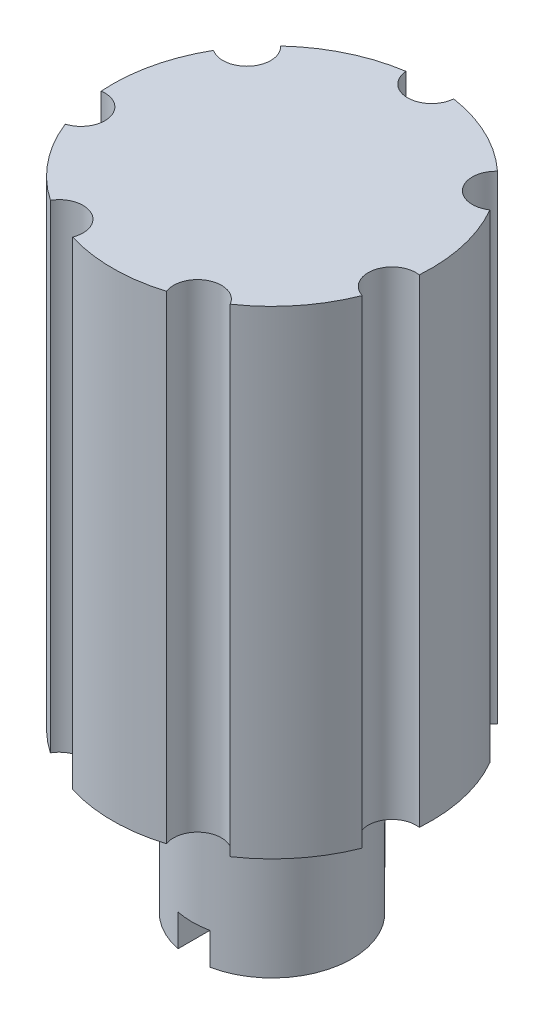
ISO-10303-21;
HEADER;
FILE_DESCRIPTION(('STEP AP214'),'2;1');
FILE_NAME('part.step','',(''),(''),'','','');
FILE_SCHEMA(('AUTOMOTIVE_DESIGN { 1 0 10303 214 1 1 1 1 }'));
ENDSEC;
DATA;
#1=APPLICATION_CONTEXT('core data for automotive mechanical design processes');
#2=APPLICATION_PROTOCOL_DEFINITION('international standard','automotive_design',2000,#1);
#3=PRODUCT_CONTEXT('',#1,'mechanical');
#4=PRODUCT('Part','Part','',(#3));
#5=PRODUCT_RELATED_PRODUCT_CATEGORY('part','',(#4));
#6=PRODUCT_DEFINITION_FORMATION('','',#4);
#7=PRODUCT_DEFINITION_CONTEXT('part definition',#1,'design');
#8=PRODUCT_DEFINITION('design','',#6,#7);
#9=PRODUCT_DEFINITION_SHAPE('','',#8);
#10=(LENGTH_UNIT() NAMED_UNIT(*) SI_UNIT(.MILLI.,.METRE.));
#11=(NAMED_UNIT(*) PLANE_ANGLE_UNIT() SI_UNIT($,.RADIAN.));
#12=(NAMED_UNIT(*) SI_UNIT($,.STERADIAN.) SOLID_ANGLE_UNIT());
#13=UNCERTAINTY_MEASURE_WITH_UNIT(LENGTH_MEASURE(1.E-05),#10,'distance_accuracy_value','');
#14=(GEOMETRIC_REPRESENTATION_CONTEXT(3) GLOBAL_UNCERTAINTY_ASSIGNED_CONTEXT((#13)) GLOBAL_UNIT_ASSIGNED_CONTEXT((#10,
#11,#12)) REPRESENTATION_CONTEXT('',''));
#15=CARTESIAN_POINT('',(0.,0.,0.));
#16=DIRECTION('',(0.,0.,1.));
#17=DIRECTION('',(1.,0.,0.));
#18=AXIS2_PLACEMENT_3D('',#15,#16,#17);
#19=CARTESIAN_POINT('',(0.,20.,0.));
#20=DIRECTION('',(0.,-1.,0.));
#21=DIRECTION('',(0.,0.,-1.));
#22=AXIS2_PLACEMENT_3D('',#19,#20,#21);
#23=CYLINDRICAL_SURFACE('',#22,5.);
#24=CARTESIAN_POINT('',(0.,5.,0.));
#25=DIRECTION('',(0.,1.,0.));
#26=DIRECTION('',(0.,0.,1.));
#27=AXIS2_PLACEMENT_3D('',#24,#25,#26);
#28=CIRCLE('',#27,5.);
#29=CARTESIAN_POINT('',(3.39887906854121,5.,-3.66709981830771));
#30=VERTEX_POINT('',#29);
#31=CARTESIAN_POINT('',(0.747887650319217,5.,-4.94375));
#32=VERTEX_POINT('',#31);
#33=EDGE_CURVE('E209',#30,#32,#28,.T.);
#34=ORIENTED_EDGE('',*,*,#33,.T.);
#35=DIRECTION('',(0.,1.,0.));
#36=VECTOR('',#35,1.);
#37=CARTESIAN_POINT('',(0.747887650319217,12.5,-4.94375));
#38=LINE('',#37,#36);
#39=CARTESIAN_POINT('',(0.747887650319217,20.,-4.94375));
#40=VERTEX_POINT('',#39);
#41=EDGE_CURVE('E226',#32,#40,#38,.T.);
#42=ORIENTED_EDGE('',*,*,#41,.T.);
#43=CARTESIAN_POINT('',(0.,20.,0.));
#44=DIRECTION('',(0.,1.,0.));
#45=DIRECTION('',(0.,0.,1.));
#46=AXIS2_PLACEMENT_3D('',#43,#44,#45);
#47=CIRCLE('',#46,5.);
#48=CARTESIAN_POINT('',(3.39887906854121,20.,-3.66709981830771));
#49=VERTEX_POINT('',#48);
#50=EDGE_CURVE('E370',#49,#40,#47,.T.);
#51=ORIENTED_EDGE('',*,*,#50,.F.);
#52=DIRECTION('',(0.,1.,0.));
#53=VECTOR('',#52,1.);
#54=CARTESIAN_POINT('',(3.39887906854121,12.5,-3.66709981830771));
#55=LINE('',#54,#53);
#56=EDGE_CURVE('E236',#49,#30,#55,.F.);
#57=ORIENTED_EDGE('',*,*,#56,.T.);
#58=EDGE_LOOP('',(#34,#42,#51,#57));
#59=FACE_BOUND('',#58,.T.);
#60=ADVANCED_FACE('F38',(#59),#23,.T.);
#61=CARTESIAN_POINT('',(4.98622052429231,5.,0.370951321774265));
#62=VERTEX_POINT('',#61);
#63=CARTESIAN_POINT('',(4.33147971436145,5.,-2.4976555975705));
#64=VERTEX_POINT('',#63);
#65=EDGE_CURVE('E207',#62,#64,#28,.T.);
#66=ORIENTED_EDGE('',*,*,#65,.T.);
#67=DIRECTION('',(0.,1.,0.));
#68=VECTOR('',#67,1.);
#69=CARTESIAN_POINT('',(4.33147971436145,12.5,-2.4976555975705));
#70=LINE('',#69,#68);
#71=CARTESIAN_POINT('',(4.33147971436145,20.,-2.4976555975705));
#72=VERTEX_POINT('',#71);
#73=EDGE_CURVE('E217',#64,#72,#70,.T.);
#74=ORIENTED_EDGE('',*,*,#73,.T.);
#75=CARTESIAN_POINT('',(4.98622052429231,20.,0.370951321774265));
#76=VERTEX_POINT('',#75);
#77=EDGE_CURVE('E193',#76,#72,#47,.T.);
#78=ORIENTED_EDGE('',*,*,#77,.F.);
#79=DIRECTION('',(0.,1.,0.));
#80=VECTOR('',#79,1.);
#81=CARTESIAN_POINT('',(4.98622052429231,12.5,0.370951321774265));
#82=LINE('',#81,#80);
#83=EDGE_CURVE('E219',#76,#62,#82,.F.);
#84=ORIENTED_EDGE('',*,*,#83,.T.);
#85=EDGE_LOOP('',(#66,#74,#78,#84));
#86=FACE_BOUND('',#85,.T.);
#87=ADVANCED_FACE('F215',(#86),#23,.T.);
#88=CARTESIAN_POINT('',(2.81883622488871,5.,4.12966855053226));
#89=VERTEX_POINT('',#88);
#90=CARTESIAN_POINT('',(4.65337920740546,5.,1.82922441271883));
#91=VERTEX_POINT('',#90);
#92=EDGE_CURVE('E220',#89,#91,#28,.T.);
#93=ORIENTED_EDGE('',*,*,#92,.T.);
#94=DIRECTION('',(0.,1.,0.));
#95=VECTOR('',#94,1.);
#96=CARTESIAN_POINT('',(4.65337920740546,12.5,1.82922441271883));
#97=LINE('',#96,#95);
#98=CARTESIAN_POINT('',(4.65337920740546,20.,1.82922441271883));
#99=VERTEX_POINT('',#98);
#100=EDGE_CURVE('E238',#91,#99,#97,.T.);
#101=ORIENTED_EDGE('',*,*,#100,.T.);
#102=CARTESIAN_POINT('',(2.81883622488871,20.,4.12966855053226));
#103=VERTEX_POINT('',#102);
#104=EDGE_CURVE('E187',#103,#99,#47,.T.);
#105=ORIENTED_EDGE('',*,*,#104,.F.);
#106=DIRECTION('',(0.,1.,0.));
#107=VECTOR('',#106,1.);
#108=CARTESIAN_POINT('',(2.81883622488871,12.5,4.12966855053226));
#109=LINE('',#108,#107);
#110=EDGE_CURVE('E245',#103,#89,#109,.F.);
#111=ORIENTED_EDGE('',*,*,#110,.T.);
#112=EDGE_LOOP('',(#93,#101,#105,#111));
#113=FACE_BOUND('',#112,.T.);
#114=ADVANCED_FACE('F322',(#113),#23,.T.);
#115=CARTESIAN_POINT('',(-1.47118924563616,5.,4.77866113085292));
#116=VERTEX_POINT('',#115);
#117=CARTESIAN_POINT('',(1.47118924563609,5.,4.77866113085294));
#118=VERTEX_POINT('',#117);
#119=EDGE_CURVE('E222',#116,#118,#28,.T.);
#120=ORIENTED_EDGE('',*,*,#119,.T.);
#121=DIRECTION('',(0.,1.,0.));
#122=VECTOR('',#121,1.);
#123=CARTESIAN_POINT('',(1.47118924563609,12.5,4.77866113085294));
#124=LINE('',#123,#122);
#125=CARTESIAN_POINT('',(1.47118924563609,20.,4.77866113085294));
#126=VERTEX_POINT('',#125);
#127=EDGE_CURVE('E242',#118,#126,#124,.T.);
#128=ORIENTED_EDGE('',*,*,#127,.T.);
#129=CARTESIAN_POINT('',(-1.47118924563616,20.,4.77866113085292));
#130=VERTEX_POINT('',#129);
#131=EDGE_CURVE('E195',#130,#126,#47,.T.);
#132=ORIENTED_EDGE('',*,*,#131,.F.);
#133=DIRECTION('',(0.,1.,0.));
#134=VECTOR('',#133,1.);
#135=CARTESIAN_POINT('',(-1.47118924563616,12.5,4.77866113085292));
#136=LINE('',#135,#134);
#137=EDGE_CURVE('E249',#130,#116,#136,.F.);
#138=ORIENTED_EDGE('',*,*,#137,.T.);
#139=EDGE_LOOP('',(#120,#128,#132,#138));
#140=FACE_BOUND('',#139,.T.);
#141=ADVANCED_FACE('F343',(#140),#23,.T.);
#142=CARTESIAN_POINT('',(-4.65337920740548,5.,1.82922441271877));
#143=VERTEX_POINT('',#142);
#144=CARTESIAN_POINT('',(-2.81883622488877,5.,4.12966855053222));
#145=VERTEX_POINT('',#144);
#146=EDGE_CURVE('E225',#143,#145,#28,.T.);
#147=ORIENTED_EDGE('',*,*,#146,.T.);
#148=DIRECTION('',(0.,1.,0.));
#149=VECTOR('',#148,1.);
#150=CARTESIAN_POINT('',(-2.81883622488877,12.5,4.12966855053222));
#151=LINE('',#150,#149);
#152=CARTESIAN_POINT('',(-2.81883622488877,20.,4.12966855053222));
#153=VERTEX_POINT('',#152);
#154=EDGE_CURVE('E61',#145,#153,#151,.T.);
#155=ORIENTED_EDGE('',*,*,#154,.T.);
#156=CARTESIAN_POINT('',(-4.65337920740548,20.,1.82922441271877));
#157=VERTEX_POINT('',#156);
#158=EDGE_CURVE('E229',#157,#153,#47,.T.);
#159=ORIENTED_EDGE('',*,*,#158,.F.);
#160=DIRECTION('',(0.,1.,0.));
#161=VECTOR('',#160,1.);
#162=CARTESIAN_POINT('',(-4.65337920740548,12.5,1.82922441271877));
#163=LINE('',#162,#161);
#164=EDGE_CURVE('E255',#157,#143,#163,.F.);
#165=ORIENTED_EDGE('',*,*,#164,.T.);
#166=EDGE_LOOP('',(#147,#155,#159,#165));
#167=FACE_BOUND('',#166,.T.);
#168=ADVANCED_FACE('F336',(#167),#23,.T.);
#169=CARTESIAN_POINT('',(-4.33147971436141,5.,-2.49765559757056));
#170=VERTEX_POINT('',#169);
#171=CARTESIAN_POINT('',(-4.98622052429232,5.,0.370951321774198));
#172=VERTEX_POINT('',#171);
#173=EDGE_CURVE('E347',#170,#172,#28,.T.);
#174=ORIENTED_EDGE('',*,*,#173,.T.);
#175=DIRECTION('',(0.,1.,0.));
#176=VECTOR('',#175,1.);
#177=CARTESIAN_POINT('',(-4.98622052429232,12.5,0.370951321774197));
#178=LINE('',#177,#176);
#179=CARTESIAN_POINT('',(-4.98622052429232,20.,0.370951321774197));
#180=VERTEX_POINT('',#179);
#181=EDGE_CURVE('E252',#172,#180,#178,.T.);
#182=ORIENTED_EDGE('',*,*,#181,.T.);
#183=CARTESIAN_POINT('',(-4.33147971436141,20.,-2.49765559757056));
#184=VERTEX_POINT('',#183);
#185=EDGE_CURVE('E366',#184,#180,#47,.T.);
#186=ORIENTED_EDGE('',*,*,#185,.F.);
#187=DIRECTION('',(0.,1.,0.));
#188=VECTOR('',#187,1.);
#189=CARTESIAN_POINT('',(-4.33147971436141,12.5,-2.49765559757056));
#190=LINE('',#189,#188);
#191=EDGE_CURVE('E261',#184,#170,#190,.F.);
#192=ORIENTED_EDGE('',*,*,#191,.T.);
#193=EDGE_LOOP('',(#174,#182,#186,#192));
#194=FACE_BOUND('',#193,.T.);
#195=ADVANCED_FACE('F327',(#194),#23,.T.);
#196=CARTESIAN_POINT('',(0.,5.,0.));
#197=DIRECTION('',(0.,-1.,0.));
#198=DIRECTION('',(0.,0.,-1.));
#199=AXIS2_PLACEMENT_3D('',#196,#197,#198);
#200=CYLINDRICAL_SURFACE('',#199,2.5);
#201=CARTESIAN_POINT('',(0.,5.,0.));
#202=DIRECTION('',(0.,1.,0.));
#203=DIRECTION('',(0.,0.,1.));
#204=AXIS2_PLACEMENT_3D('',#201,#202,#203);
#205=CIRCLE('',#204,2.5);
#206=CARTESIAN_POINT('',(0.,5.,2.5));
#207=VERTEX_POINT('',#206);
#208=EDGE_CURVE('E186',#207,#207,#205,.T.);
#209=ORIENTED_EDGE('',*,*,#208,.F.);
#210=EDGE_LOOP('',(#209));
#211=FACE_BOUND('',#210,.T.);
#212=CARTESIAN_POINT('',(0.,1.,0.));
#213=DIRECTION('',(0.,-1.,0.));
#214=DIRECTION('',(0.,0.,-1.));
#215=AXIS2_PLACEMENT_3D('',#212,#213,#214);
#216=CIRCLE('',#215,2.5);
#217=CARTESIAN_POINT('',(-0.5,1.,2.44948974278318));
#218=VERTEX_POINT('',#217);
#219=CARTESIAN_POINT('',(0.5,1.,2.44948974278318));
#220=VERTEX_POINT('',#219);
#221=EDGE_CURVE('E289',#218,#220,#216,.F.);
#222=ORIENTED_EDGE('',*,*,#221,.T.);
#223=DIRECTION('',(0.,-1.,0.));
#224=VECTOR('',#223,1.);
#225=CARTESIAN_POINT('',(0.5,2.68353211472345,2.44948974278318));
#226=LINE('',#225,#224);
#227=CARTESIAN_POINT('',(0.5,0.,2.44948974278318));
#228=VERTEX_POINT('',#227);
#229=EDGE_CURVE('E185',#220,#228,#226,.T.);
#230=ORIENTED_EDGE('',*,*,#229,.T.);
#231=CARTESIAN_POINT('',(0.,0.,0.));
#232=DIRECTION('',(0.,1.,0.));
#233=DIRECTION('',(0.,0.,1.));
#234=AXIS2_PLACEMENT_3D('',#231,#232,#233);
#235=CIRCLE('',#234,2.5);
#236=CARTESIAN_POINT('',(-0.5,0.,2.44948974278318));
#237=VERTEX_POINT('',#236);
#238=EDGE_CURVE('E179',#228,#237,#235,.T.);
#239=ORIENTED_EDGE('',*,*,#238,.T.);
#240=DIRECTION('',(0.,-1.,0.));
#241=VECTOR('',#240,1.);
#242=CARTESIAN_POINT('',(-0.5,2.68353211472345,2.44948974278318));
#243=LINE('',#242,#241);
#244=EDGE_CURVE('E163',#218,#237,#243,.T.);
#245=ORIENTED_EDGE('',*,*,#244,.F.);
#246=EDGE_LOOP('',(#222,#230,#239,#245));
#247=FACE_BOUND('',#246,.T.);
#248=ADVANCED_FACE('F40',(#211,#247),#200,.T.);
#249=CARTESIAN_POINT('',(0.,0.,0.));
#250=DIRECTION('',(0.,1.,0.));
#251=DIRECTION('',(0.,0.,1.));
#252=AXIS2_PLACEMENT_3D('',#249,#250,#251);
#253=PLANE('',#252);
#254=ORIENTED_EDGE('',*,*,#238,.F.);
#255=DIRECTION('',(0.,0.,1.));
#256=VECTOR('',#255,1.);
#257=CARTESIAN_POINT('',(0.5,0.,2.44948974278318));
#258=LINE('',#257,#256);
#259=CARTESIAN_POINT('',(0.5,0.,1.14564392373896));
#260=VERTEX_POINT('',#259);
#261=EDGE_CURVE('E172',#260,#228,#258,.T.);
#262=ORIENTED_EDGE('',*,*,#261,.F.);
#263=CARTESIAN_POINT('',(0.,0.,0.));
#264=DIRECTION('',(0.,-1.,0.));
#265=DIRECTION('',(0.,0.,-1.));
#266=AXIS2_PLACEMENT_3D('',#263,#264,#265);
#267=CIRCLE('',#266,1.25);
#268=CARTESIAN_POINT('',(-0.5,0.,1.14564392373896));
#269=VERTEX_POINT('',#268);
#270=EDGE_CURVE('E181',#269,#260,#267,.T.);
#271=ORIENTED_EDGE('',*,*,#270,.F.);
#272=DIRECTION('',(0.,0.,-1.));
#273=VECTOR('',#272,1.);
#274=CARTESIAN_POINT('',(-0.5,0.,2.44948974278318));
#275=LINE('',#274,#273);
#276=EDGE_CURVE('E166',#237,#269,#275,.T.);
#277=ORIENTED_EDGE('',*,*,#276,.F.);
#278=EDGE_LOOP('',(#254,#262,#271,#277));
#279=FACE_BOUND('',#278,.T.);
#280=ADVANCED_FACE('F177',(#279),#253,.F.);
#281=CARTESIAN_POINT('',(-0.747887650319217,20.,-4.94375));
#282=VERTEX_POINT('',#281);
#283=CARTESIAN_POINT('',(-3.39887906854115,20.,-3.66709981830776));
#284=VERTEX_POINT('',#283);
#285=EDGE_CURVE('E367',#282,#284,#47,.T.);
#286=ORIENTED_EDGE('',*,*,#285,.F.);
#287=DIRECTION('',(0.,1.,0.));
#288=VECTOR('',#287,1.);
#289=CARTESIAN_POINT('',(-0.747887650319217,12.5,-4.94375));
#290=LINE('',#289,#288);
#291=CARTESIAN_POINT('',(-0.747887650319217,5.,-4.94375));
#292=VERTEX_POINT('',#291);
#293=EDGE_CURVE('E232',#282,#292,#290,.F.);
#294=ORIENTED_EDGE('',*,*,#293,.T.);
#295=CARTESIAN_POINT('',(-3.39887906854116,5.,-3.66709981830776));
#296=VERTEX_POINT('',#295);
#297=EDGE_CURVE('E223',#292,#296,#28,.T.);
#298=ORIENTED_EDGE('',*,*,#297,.T.);
#299=DIRECTION('',(0.,1.,0.));
#300=VECTOR('',#299,1.);
#301=CARTESIAN_POINT('',(-3.39887906854115,12.5,-3.66709981830776));
#302=LINE('',#301,#300);
#303=EDGE_CURVE('E258',#296,#284,#302,.T.);
#304=ORIENTED_EDGE('',*,*,#303,.T.);
#305=EDGE_LOOP('',(#286,#294,#298,#304));
#306=FACE_BOUND('',#305,.T.);
#307=ADVANCED_FACE('F318',(#306),#23,.T.);
#308=CARTESIAN_POINT('',(0.,20.,0.));
#309=DIRECTION('',(0.,1.,0.));
#310=DIRECTION('',(0.,0.,1.));
#311=AXIS2_PLACEMENT_3D('',#308,#309,#310);
#312=PLANE('',#311);
#313=CARTESIAN_POINT('',(0.,20.,-5.));
#314=DIRECTION('',(0.,1.,0.));
#315=DIRECTION('',(0.,0.,1.));
#316=AXIS2_PLACEMENT_3D('',#313,#314,#315);
#317=CIRCLE('',#316,0.75);
#318=EDGE_CURVE('E264',#282,#40,#317,.T.);
#319=ORIENTED_EDGE('',*,*,#318,.F.);
#320=ORIENTED_EDGE('',*,*,#285,.T.);
#321=CARTESIAN_POINT('',(-3.90915741234011,20.,-3.11744900929372));
#322=DIRECTION('',(0.,1.,0.));
#323=DIRECTION('',(0.,0.,1.));
#324=AXIS2_PLACEMENT_3D('',#321,#322,#323);
#325=CIRCLE('',#324,0.75);
#326=EDGE_CURVE('E265',#184,#284,#325,.T.);
#327=ORIENTED_EDGE('',*,*,#326,.F.);
#328=ORIENTED_EDGE('',*,*,#185,.T.);
#329=CARTESIAN_POINT('',(-4.87463956090913,20.,1.11260466978153));
#330=DIRECTION('',(0.,1.,0.));
#331=DIRECTION('',(0.,0.,1.));
#332=AXIS2_PLACEMENT_3D('',#329,#330,#331);
#333=CIRCLE('',#332,0.75);
#334=EDGE_CURVE('E269',#157,#180,#333,.T.);
#335=ORIENTED_EDGE('',*,*,#334,.F.);
#336=ORIENTED_EDGE('',*,*,#158,.T.);
#337=CARTESIAN_POINT('',(-2.16941869558783,20.,4.50484433951208));
#338=DIRECTION('',(0.,1.,0.));
#339=DIRECTION('',(0.,0.,1.));
#340=AXIS2_PLACEMENT_3D('',#337,#338,#339);
#341=CIRCLE('',#340,0.75);
#342=EDGE_CURVE('E273',#130,#153,#341,.T.);
#343=ORIENTED_EDGE('',*,*,#342,.F.);
#344=ORIENTED_EDGE('',*,*,#131,.T.);
#345=CARTESIAN_POINT('',(2.16941869558776,20.,4.50484433951211));
#346=DIRECTION('',(0.,1.,0.));
#347=DIRECTION('',(0.,0.,1.));
#348=AXIS2_PLACEMENT_3D('',#345,#346,#347);
#349=CIRCLE('',#348,0.75);
#350=EDGE_CURVE('E277',#103,#126,#349,.T.);
#351=ORIENTED_EDGE('',*,*,#350,.F.);
#352=ORIENTED_EDGE('',*,*,#104,.T.);
#353=CARTESIAN_POINT('',(4.87463956090911,20.,1.11260466978159));
#354=DIRECTION('',(0.,1.,0.));
#355=DIRECTION('',(0.,0.,1.));
#356=AXIS2_PLACEMENT_3D('',#353,#354,#355);
#357=CIRCLE('',#356,0.75);
#358=EDGE_CURVE('E281',#76,#99,#357,.T.);
#359=ORIENTED_EDGE('',*,*,#358,.F.);
#360=ORIENTED_EDGE('',*,*,#77,.T.);
#361=CARTESIAN_POINT('',(3.90915741234015,20.,-3.11744900929366));
#362=DIRECTION('',(0.,1.,0.));
#363=DIRECTION('',(0.,0.,1.));
#364=AXIS2_PLACEMENT_3D('',#361,#362,#363);
#365=CIRCLE('',#364,0.75);
#366=EDGE_CURVE('E283',#49,#72,#365,.T.);
#367=ORIENTED_EDGE('',*,*,#366,.F.);
#368=ORIENTED_EDGE('',*,*,#50,.T.);
#369=EDGE_LOOP('',(#319,#320,#327,#328,#335,#336,#343,#344,#351,#352,#359,#360,#367,#368));
#370=FACE_BOUND('',#369,.T.);
#371=ADVANCED_FACE('F325',(#370),#312,.T.);
#372=CARTESIAN_POINT('',(0.,5.,0.));
#373=DIRECTION('',(0.,1.,0.));
#374=DIRECTION('',(0.,0.,1.));
#375=AXIS2_PLACEMENT_3D('',#372,#373,#374);
#376=PLANE('',#375);
#377=ORIENTED_EDGE('',*,*,#208,.T.);
#378=EDGE_LOOP('',(#377));
#379=FACE_BOUND('',#378,.T.);
#380=ORIENTED_EDGE('',*,*,#297,.F.);
#381=CARTESIAN_POINT('',(0.,5.,-5.));
#382=DIRECTION('',(0.,1.,0.));
#383=DIRECTION('',(0.,0.,1.));
#384=AXIS2_PLACEMENT_3D('',#381,#382,#383);
#385=CIRCLE('',#384,0.75);
#386=EDGE_CURVE('E11',#292,#32,#385,.T.);
#387=ORIENTED_EDGE('',*,*,#386,.T.);
#388=ORIENTED_EDGE('',*,*,#33,.F.);
#389=CARTESIAN_POINT('',(3.90915741234015,5.,-3.11744900929366));
#390=DIRECTION('',(0.,1.,0.));
#391=DIRECTION('',(0.,0.,1.));
#392=AXIS2_PLACEMENT_3D('',#389,#390,#391);
#393=CIRCLE('',#392,0.75);
#394=EDGE_CURVE('E46',#30,#64,#393,.T.);
#395=ORIENTED_EDGE('',*,*,#394,.T.);
#396=ORIENTED_EDGE('',*,*,#65,.F.);
#397=CARTESIAN_POINT('',(4.87463956090911,5.,1.11260466978159));
#398=DIRECTION('',(0.,1.,0.));
#399=DIRECTION('',(0.,0.,1.));
#400=AXIS2_PLACEMENT_3D('',#397,#398,#399);
#401=CIRCLE('',#400,0.75);
#402=EDGE_CURVE('E279',#91,#62,#401,.F.);
#403=ORIENTED_EDGE('',*,*,#402,.F.);
#404=ORIENTED_EDGE('',*,*,#92,.F.);
#405=CARTESIAN_POINT('',(2.16941869558776,5.,4.50484433951211));
#406=DIRECTION('',(0.,1.,0.));
#407=DIRECTION('',(0.,0.,1.));
#408=AXIS2_PLACEMENT_3D('',#405,#406,#407);
#409=CIRCLE('',#408,0.75);
#410=EDGE_CURVE('E275',#118,#89,#409,.F.);
#411=ORIENTED_EDGE('',*,*,#410,.F.);
#412=ORIENTED_EDGE('',*,*,#119,.F.);
#413=CARTESIAN_POINT('',(-2.16941869558783,5.,4.50484433951208));
#414=DIRECTION('',(0.,1.,0.));
#415=DIRECTION('',(0.,0.,1.));
#416=AXIS2_PLACEMENT_3D('',#413,#414,#415);
#417=CIRCLE('',#416,0.75);
#418=EDGE_CURVE('E271',#145,#116,#417,.F.);
#419=ORIENTED_EDGE('',*,*,#418,.F.);
#420=ORIENTED_EDGE('',*,*,#146,.F.);
#421=CARTESIAN_POINT('',(-4.87463956090913,5.,1.11260466978153));
#422=DIRECTION('',(0.,1.,0.));
#423=DIRECTION('',(0.,0.,1.));
#424=AXIS2_PLACEMENT_3D('',#421,#422,#423);
#425=CIRCLE('',#424,0.75);
#426=EDGE_CURVE('E267',#172,#143,#425,.F.);
#427=ORIENTED_EDGE('',*,*,#426,.F.);
#428=ORIENTED_EDGE('',*,*,#173,.F.);
#429=CARTESIAN_POINT('',(-3.90915741234011,5.,-3.11744900929372));
#430=DIRECTION('',(0.,1.,0.));
#431=DIRECTION('',(0.,0.,1.));
#432=AXIS2_PLACEMENT_3D('',#429,#430,#431);
#433=CIRCLE('',#432,0.75);
#434=EDGE_CURVE('E190',#170,#296,#433,.T.);
#435=ORIENTED_EDGE('',*,*,#434,.T.);
#436=EDGE_LOOP('',(#380,#387,#388,#395,#396,#403,#404,#411,#412,#419,#420,#427,#428,#435));
#437=FACE_BOUND('',#436,.T.);
#438=ADVANCED_FACE('F205',(#379,#437),#376,.F.);
#439=CARTESIAN_POINT('',(-3.90915741234011,2.87867965644036,-3.11744900929372));
#440=DIRECTION('',(0.,1.,0.));
#441=DIRECTION('',(0.,0.,1.));
#442=AXIS2_PLACEMENT_3D('',#439,#440,#441);
#443=CYLINDRICAL_SURFACE('',#442,0.75);
#444=ORIENTED_EDGE('',*,*,#434,.F.);
#445=ORIENTED_EDGE('',*,*,#191,.F.);
#446=ORIENTED_EDGE('',*,*,#326,.T.);
#447=ORIENTED_EDGE('',*,*,#303,.F.);
#448=EDGE_LOOP('',(#444,#445,#446,#447));
#449=FACE_BOUND('',#448,.T.);
#450=ADVANCED_FACE('F395',(#449),#443,.F.);
#451=CARTESIAN_POINT('',(-4.87463956090913,2.87867965644036,1.11260466978153));
#452=DIRECTION('',(0.,1.,0.));
#453=DIRECTION('',(0.,0.,1.));
#454=AXIS2_PLACEMENT_3D('',#451,#452,#453);
#455=CYLINDRICAL_SURFACE('',#454,0.75);
#456=ORIENTED_EDGE('',*,*,#426,.T.);
#457=ORIENTED_EDGE('',*,*,#164,.F.);
#458=ORIENTED_EDGE('',*,*,#334,.T.);
#459=ORIENTED_EDGE('',*,*,#181,.F.);
#460=EDGE_LOOP('',(#456,#457,#458,#459));
#461=FACE_BOUND('',#460,.T.);
#462=ADVANCED_FACE('F389',(#461),#455,.F.);
#463=CARTESIAN_POINT('',(-2.16941869558783,2.87867965644036,4.50484433951208));
#464=DIRECTION('',(0.,1.,0.));
#465=DIRECTION('',(0.,0.,1.));
#466=AXIS2_PLACEMENT_3D('',#463,#464,#465);
#467=CYLINDRICAL_SURFACE('',#466,0.75);
#468=ORIENTED_EDGE('',*,*,#418,.T.);
#469=ORIENTED_EDGE('',*,*,#137,.F.);
#470=ORIENTED_EDGE('',*,*,#342,.T.);
#471=ORIENTED_EDGE('',*,*,#154,.F.);
#472=EDGE_LOOP('',(#468,#469,#470,#471));
#473=FACE_BOUND('',#472,.T.);
#474=ADVANCED_FACE('F358',(#473),#467,.F.);
#475=CARTESIAN_POINT('',(2.16941869558776,2.87867965644036,4.50484433951211));
#476=DIRECTION('',(0.,1.,0.));
#477=DIRECTION('',(0.,0.,1.));
#478=AXIS2_PLACEMENT_3D('',#475,#476,#477);
#479=CYLINDRICAL_SURFACE('',#478,0.75);
#480=ORIENTED_EDGE('',*,*,#410,.T.);
#481=ORIENTED_EDGE('',*,*,#110,.F.);
#482=ORIENTED_EDGE('',*,*,#350,.T.);
#483=ORIENTED_EDGE('',*,*,#127,.F.);
#484=EDGE_LOOP('',(#480,#481,#482,#483));
#485=FACE_BOUND('',#484,.T.);
#486=ADVANCED_FACE('F380',(#485),#479,.F.);
#487=CARTESIAN_POINT('',(4.87463956090911,2.87867965644036,1.11260466978159));
#488=DIRECTION('',(0.,1.,0.));
#489=DIRECTION('',(0.,0.,1.));
#490=AXIS2_PLACEMENT_3D('',#487,#488,#489);
#491=CYLINDRICAL_SURFACE('',#490,0.75);
#492=ORIENTED_EDGE('',*,*,#402,.T.);
#493=ORIENTED_EDGE('',*,*,#83,.F.);
#494=ORIENTED_EDGE('',*,*,#358,.T.);
#495=ORIENTED_EDGE('',*,*,#100,.F.);
#496=EDGE_LOOP('',(#492,#493,#494,#495));
#497=FACE_BOUND('',#496,.T.);
#498=ADVANCED_FACE('F376',(#497),#491,.F.);
#499=CARTESIAN_POINT('',(3.90915741234015,2.87867965644036,-3.11744900929366));
#500=DIRECTION('',(0.,1.,0.));
#501=DIRECTION('',(0.,0.,1.));
#502=AXIS2_PLACEMENT_3D('',#499,#500,#501);
#503=CYLINDRICAL_SURFACE('',#502,0.75);
#504=ORIENTED_EDGE('',*,*,#394,.F.);
#505=ORIENTED_EDGE('',*,*,#56,.F.);
#506=ORIENTED_EDGE('',*,*,#366,.T.);
#507=ORIENTED_EDGE('',*,*,#73,.F.);
#508=EDGE_LOOP('',(#504,#505,#506,#507));
#509=FACE_BOUND('',#508,.T.);
#510=ADVANCED_FACE('F387',(#509),#503,.F.);
#511=CARTESIAN_POINT('',(0.,2.87867965644036,-5.));
#512=DIRECTION('',(0.,1.,0.));
#513=DIRECTION('',(0.,0.,1.));
#514=AXIS2_PLACEMENT_3D('',#511,#512,#513);
#515=CYLINDRICAL_SURFACE('',#514,0.75);
#516=ORIENTED_EDGE('',*,*,#386,.F.);
#517=ORIENTED_EDGE('',*,*,#293,.F.);
#518=ORIENTED_EDGE('',*,*,#318,.T.);
#519=ORIENTED_EDGE('',*,*,#41,.F.);
#520=EDGE_LOOP('',(#516,#517,#518,#519));
#521=FACE_BOUND('',#520,.T.);
#522=ADVANCED_FACE('F312',(#521),#515,.F.);
#523=CARTESIAN_POINT('',(0.,1.,0.));
#524=DIRECTION('',(0.,-1.,0.));
#525=DIRECTION('',(0.,0.,-1.));
#526=AXIS2_PLACEMENT_3D('',#523,#524,#525);
#527=CYLINDRICAL_SURFACE('',#526,1.25);
#528=ORIENTED_EDGE('',*,*,#270,.T.);
#529=DIRECTION('',(0.,-1.,0.));
#530=VECTOR('',#529,1.);
#531=CARTESIAN_POINT('',(0.5,2.68353211472345,1.14564392373896));
#532=LINE('',#531,#530);
#533=CARTESIAN_POINT('',(0.5,1.,1.14564392373896));
#534=VERTEX_POINT('',#533);
#535=EDGE_CURVE('E292',#534,#260,#532,.T.);
#536=ORIENTED_EDGE('',*,*,#535,.F.);
#537=CARTESIAN_POINT('',(0.,1.,0.));
#538=DIRECTION('',(0.,-1.,0.));
#539=DIRECTION('',(0.,0.,-1.));
#540=AXIS2_PLACEMENT_3D('',#537,#538,#539);
#541=CIRCLE('',#540,1.25);
#542=CARTESIAN_POINT('',(-0.5,1.,1.14564392373896));
#543=VERTEX_POINT('',#542);
#544=EDGE_CURVE('E268',#543,#534,#541,.T.);
#545=ORIENTED_EDGE('',*,*,#544,.F.);
#546=DIRECTION('',(0.,-1.,0.));
#547=VECTOR('',#546,1.);
#548=CARTESIAN_POINT('',(-0.5,2.68353211472345,1.14564392373896));
#549=LINE('',#548,#547);
#550=EDGE_CURVE('E171',#543,#269,#549,.T.);
#551=ORIENTED_EDGE('',*,*,#550,.T.);
#552=EDGE_LOOP('',(#528,#536,#545,#551));
#553=FACE_BOUND('',#552,.T.);
#554=ADVANCED_FACE('F303',(#553),#527,.F.);
#555=CARTESIAN_POINT('',(0.,1.,0.));
#556=DIRECTION('',(0.,-1.,0.));
#557=DIRECTION('',(0.,0.,-1.));
#558=AXIS2_PLACEMENT_3D('',#555,#556,#557);
#559=PLANE('',#558);
#560=ORIENTED_EDGE('',*,*,#544,.T.);
#561=DIRECTION('',(0.,0.,-1.));
#562=VECTOR('',#561,1.);
#563=CARTESIAN_POINT('',(0.5,1.,2.44948974278318));
#564=LINE('',#563,#562);
#565=EDGE_CURVE('E295',#220,#534,#564,.T.);
#566=ORIENTED_EDGE('',*,*,#565,.F.);
#567=ORIENTED_EDGE('',*,*,#221,.F.);
#568=DIRECTION('',(0.,0.,1.));
#569=VECTOR('',#568,1.);
#570=CARTESIAN_POINT('',(-0.5,1.,2.44948974278318));
#571=LINE('',#570,#569);
#572=EDGE_CURVE('E53',#543,#218,#571,.T.);
#573=ORIENTED_EDGE('',*,*,#572,.F.);
#574=EDGE_LOOP('',(#560,#566,#567,#573));
#575=FACE_BOUND('',#574,.T.);
#576=ADVANCED_FACE('F304',(#575),#559,.T.);
#577=CARTESIAN_POINT('',(0.5,2.68353211472345,2.44948974278318));
#578=DIRECTION('',(1.,0.,0.));
#579=DIRECTION('',(0.,0.,-1.));
#580=AXIS2_PLACEMENT_3D('',#577,#578,#579);
#581=PLANE('',#580);
#582=ORIENTED_EDGE('',*,*,#565,.T.);
#583=ORIENTED_EDGE('',*,*,#535,.T.);
#584=ORIENTED_EDGE('',*,*,#261,.T.);
#585=ORIENTED_EDGE('',*,*,#229,.F.);
#586=EDGE_LOOP('',(#582,#583,#584,#585));
#587=FACE_BOUND('',#586,.T.);
#588=ADVANCED_FACE('F300',(#587),#581,.F.);
#589=CARTESIAN_POINT('',(-0.5,2.68353211472345,2.44948974278318));
#590=DIRECTION('',(-1.,0.,0.));
#591=DIRECTION('',(0.,0.,1.));
#592=AXIS2_PLACEMENT_3D('',#589,#590,#591);
#593=PLANE('',#592);
#594=ORIENTED_EDGE('',*,*,#572,.T.);
#595=ORIENTED_EDGE('',*,*,#244,.T.);
#596=ORIENTED_EDGE('',*,*,#276,.T.);
#597=ORIENTED_EDGE('',*,*,#550,.F.);
#598=EDGE_LOOP('',(#594,#595,#596,#597));
#599=FACE_BOUND('',#598,.T.);
#600=ADVANCED_FACE('F165',(#599),#593,.F.);
#601=CLOSED_SHELL('',(#60,#87,#114,#141,#168,#195,#248,#280,#307,#371,#438,#450,#462,#474,#486,
#498,#510,#522,#554,#576,#588,#600));
#602=MANIFOLD_SOLID_BREP('B2',#601);
#603=ADVANCED_BREP_SHAPE_REPRESENTATION('',(#18,#602),#14);
#604=SHAPE_DEFINITION_REPRESENTATION(#9,#603);
ENDSEC;
END-ISO-10303-21;
